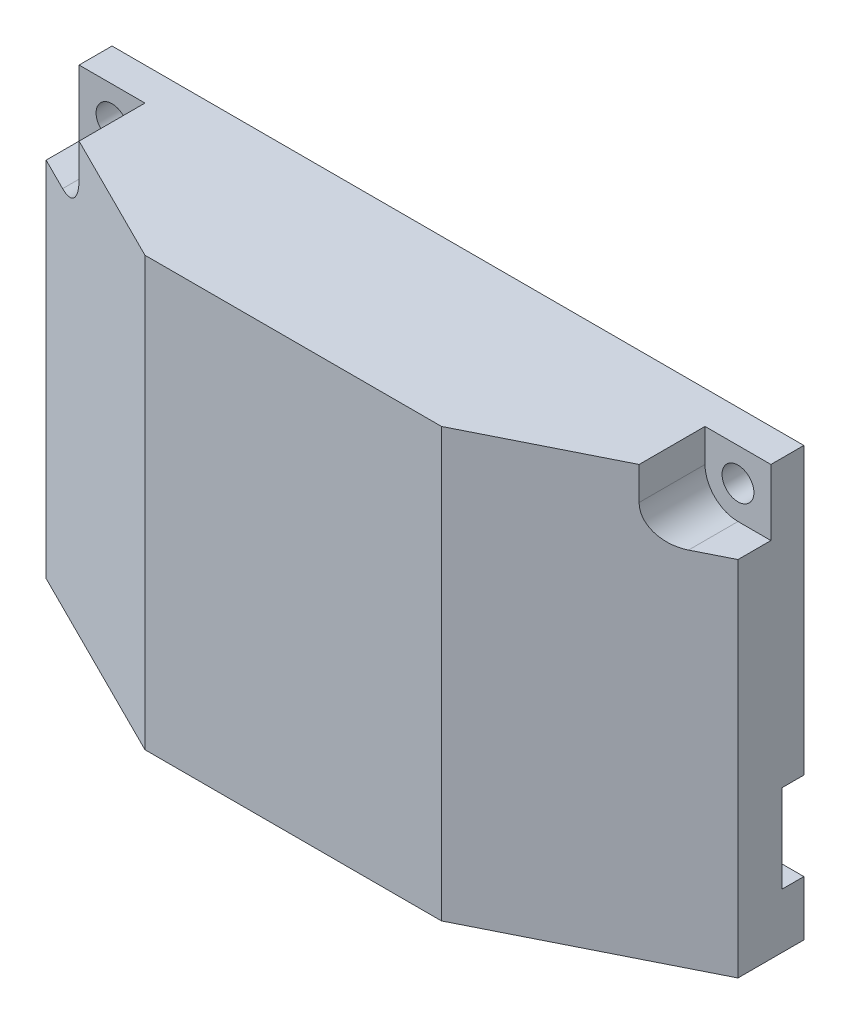
ISO-10303-21;
HEADER;
FILE_DESCRIPTION(('STEP AP214'),'2;1');
FILE_NAME('part.step','',(''),(''),'','','');
FILE_SCHEMA(('AUTOMOTIVE_DESIGN { 1 0 10303 214 1 1 1 1 }'));
ENDSEC;
DATA;
#1=APPLICATION_CONTEXT('core data for automotive mechanical design processes');
#2=APPLICATION_PROTOCOL_DEFINITION('international standard','automotive_design',2000,#1);
#3=PRODUCT_CONTEXT('',#1,'mechanical');
#4=PRODUCT('Part','Part','',(#3));
#5=PRODUCT_RELATED_PRODUCT_CATEGORY('part','',(#4));
#6=PRODUCT_DEFINITION_FORMATION('','',#4);
#7=PRODUCT_DEFINITION_CONTEXT('part definition',#1,'design');
#8=PRODUCT_DEFINITION('design','',#6,#7);
#9=PRODUCT_DEFINITION_SHAPE('','',#8);
#10=(LENGTH_UNIT() NAMED_UNIT(*) SI_UNIT(.MILLI.,.METRE.));
#11=(NAMED_UNIT(*) PLANE_ANGLE_UNIT() SI_UNIT($,.RADIAN.));
#12=(NAMED_UNIT(*) SI_UNIT($,.STERADIAN.) SOLID_ANGLE_UNIT());
#13=UNCERTAINTY_MEASURE_WITH_UNIT(LENGTH_MEASURE(1.E-05),#10,'distance_accuracy_value','');
#14=(GEOMETRIC_REPRESENTATION_CONTEXT(3) GLOBAL_UNCERTAINTY_ASSIGNED_CONTEXT((#13)) GLOBAL_UNIT_ASSIGNED_CONTEXT((#10,
#11,#12)) REPRESENTATION_CONTEXT('',''));
#15=CARTESIAN_POINT('',(0.,0.,0.));
#16=DIRECTION('',(0.,0.,1.));
#17=DIRECTION('',(1.,0.,0.));
#18=AXIS2_PLACEMENT_3D('',#15,#16,#17);
#19=CARTESIAN_POINT('',(3.,30.,33.));
#20=DIRECTION('',(0.,0.,-1.));
#21=DIRECTION('',(-1.,0.,0.));
#22=AXIS2_PLACEMENT_3D('',#19,#20,#21);
#23=CYLINDRICAL_SURFACE('',#22,1.45);
#24=CARTESIAN_POINT('',(3.,30.,0.));
#25=DIRECTION('',(0.,0.,-1.));
#26=DIRECTION('',(-1.,0.,0.));
#27=AXIS2_PLACEMENT_3D('',#24,#25,#26);
#28=CIRCLE('',#27,1.45);
#29=CARTESIAN_POINT('',(1.55,30.,0.));
#30=VERTEX_POINT('',#29);
#31=EDGE_CURVE('E363',#30,#30,#28,.T.);
#32=ORIENTED_EDGE('',*,*,#31,.T.);
#33=EDGE_LOOP('',(#32));
#34=FACE_BOUND('',#33,.T.);
#35=CARTESIAN_POINT('',(3.,30.,3.));
#36=DIRECTION('',(0.,0.,1.));
#37=DIRECTION('',(1.,0.,0.));
#38=AXIS2_PLACEMENT_3D('',#35,#36,#37);
#39=CIRCLE('',#38,1.45);
#40=CARTESIAN_POINT('',(4.45,30.,3.));
#41=VERTEX_POINT('',#40);
#42=EDGE_CURVE('E359',#41,#41,#39,.F.);
#43=ORIENTED_EDGE('',*,*,#42,.F.);
#44=EDGE_LOOP('',(#43));
#45=FACE_BOUND('',#44,.T.);
#46=ADVANCED_FACE('F36',(#34,#45),#23,.F.);
#47=CARTESIAN_POINT('',(60.,30.,33.));
#48=DIRECTION('',(0.,0.,-1.));
#49=DIRECTION('',(-1.,0.,0.));
#50=AXIS2_PLACEMENT_3D('',#47,#48,#49);
#51=CYLINDRICAL_SURFACE('',#50,1.45);
#52=CARTESIAN_POINT('',(60.,30.,0.));
#53=DIRECTION('',(0.,0.,-1.));
#54=DIRECTION('',(-1.,0.,0.));
#55=AXIS2_PLACEMENT_3D('',#52,#53,#54);
#56=CIRCLE('',#55,1.45);
#57=CARTESIAN_POINT('',(58.55,30.,0.));
#58=VERTEX_POINT('',#57);
#59=EDGE_CURVE('E412',#58,#58,#56,.T.);
#60=ORIENTED_EDGE('',*,*,#59,.T.);
#61=EDGE_LOOP('',(#60));
#62=FACE_BOUND('',#61,.T.);
#63=CARTESIAN_POINT('',(60.,30.,3.));
#64=DIRECTION('',(0.,0.,1.));
#65=DIRECTION('',(1.,0.,0.));
#66=AXIS2_PLACEMENT_3D('',#63,#64,#65);
#67=CIRCLE('',#66,1.45);
#68=CARTESIAN_POINT('',(61.45,30.,3.));
#69=VERTEX_POINT('',#68);
#70=EDGE_CURVE('E356',#69,#69,#67,.F.);
#71=ORIENTED_EDGE('',*,*,#70,.F.);
#72=EDGE_LOOP('',(#71));
#73=FACE_BOUND('',#72,.T.);
#74=ADVANCED_FACE('F565',(#62,#73),#51,.F.);
#75=CARTESIAN_POINT('',(0.,0.,0.));
#76=DIRECTION('',(0.,0.,-1.));
#77=DIRECTION('',(-1.,0.,0.));
#78=AXIS2_PLACEMENT_3D('',#75,#76,#77);
#79=PLANE('',#78);
#80=DIRECTION('',(-1.,0.,0.));
#81=VECTOR('',#80,1.);
#82=CARTESIAN_POINT('',(61.,-1.00000000000001,0.));
#83=LINE('',#82,#81);
#84=CARTESIAN_POINT('',(63.,-1.00000000000001,0.));
#85=VERTEX_POINT('',#84);
#86=CARTESIAN_POINT('',(61.,-1.00000000000001,0.));
#87=VERTEX_POINT('',#86);
#88=EDGE_CURVE('E475',#85,#87,#83,.T.);
#89=ORIENTED_EDGE('',*,*,#88,.F.);
#90=DIRECTION('',(0.,1.,0.));
#91=VECTOR('',#90,1.);
#92=CARTESIAN_POINT('',(63.,0.,0.));
#93=LINE('',#92,#91);
#94=CARTESIAN_POINT('',(63.,-6.,0.));
#95=VERTEX_POINT('',#94);
#96=EDGE_CURVE('E327',#95,#85,#93,.T.);
#97=ORIENTED_EDGE('',*,*,#96,.F.);
#98=DIRECTION('',(1.,0.,0.));
#99=VECTOR('',#98,1.);
#100=CARTESIAN_POINT('',(63.,-6.,0.));
#101=LINE('',#100,#99);
#102=CARTESIAN_POINT('',(0.,-6.00000000000001,0.));
#103=VERTEX_POINT('',#102);
#104=EDGE_CURVE('E316',#103,#95,#101,.T.);
#105=ORIENTED_EDGE('',*,*,#104,.F.);
#106=DIRECTION('',(0.,-1.,0.));
#107=VECTOR('',#106,1.);
#108=CARTESIAN_POINT('',(0.,0.,0.));
#109=LINE('',#108,#107);
#110=CARTESIAN_POINT('',(0.,33.,0.));
#111=VERTEX_POINT('',#110);
#112=EDGE_CURVE('E320',#111,#103,#109,.T.);
#113=ORIENTED_EDGE('',*,*,#112,.F.);
#114=DIRECTION('',(-1.,0.,0.));
#115=VECTOR('',#114,1.);
#116=CARTESIAN_POINT('',(0.,33.,0.));
#117=LINE('',#116,#115);
#118=CARTESIAN_POINT('',(63.,33.,0.));
#119=VERTEX_POINT('',#118);
#120=EDGE_CURVE('E330',#119,#111,#117,.T.);
#121=ORIENTED_EDGE('',*,*,#120,.F.);
#122=CARTESIAN_POINT('',(63.,6.99999999999999,0.));
#123=VERTEX_POINT('',#122);
#124=EDGE_CURVE('E326',#123,#119,#93,.T.);
#125=ORIENTED_EDGE('',*,*,#124,.F.);
#126=DIRECTION('',(1.,0.,0.));
#127=VECTOR('',#126,1.);
#128=CARTESIAN_POINT('',(61.,6.99999999999999,0.));
#129=LINE('',#128,#127);
#130=CARTESIAN_POINT('',(61.,6.99999999999999,0.));
#131=VERTEX_POINT('',#130);
#132=EDGE_CURVE('E471',#131,#123,#129,.T.);
#133=ORIENTED_EDGE('',*,*,#132,.F.);
#134=DIRECTION('',(0.,1.,0.));
#135=VECTOR('',#134,1.);
#136=CARTESIAN_POINT('',(61.,0.,0.));
#137=LINE('',#136,#135);
#138=CARTESIAN_POINT('',(61.,26.1270166537926,0.));
#139=VERTEX_POINT('',#138);
#140=EDGE_CURVE('E294',#131,#139,#137,.T.);
#141=ORIENTED_EDGE('',*,*,#140,.T.);
#142=CARTESIAN_POINT('',(60.,30.,0.));
#143=DIRECTION('',(0.,0.,-1.));
#144=DIRECTION('',(-1.,0.,0.));
#145=AXIS2_PLACEMENT_3D('',#142,#143,#144);
#146=CIRCLE('',#145,4.);
#147=CARTESIAN_POINT('',(56.1270166537926,31.,0.));
#148=VERTEX_POINT('',#147);
#149=EDGE_CURVE('E423',#139,#148,#146,.T.);
#150=ORIENTED_EDGE('',*,*,#149,.T.);
#151=DIRECTION('',(-1.,0.,0.));
#152=VECTOR('',#151,1.);
#153=CARTESIAN_POINT('',(0.,31.,0.));
#154=LINE('',#153,#152);
#155=CARTESIAN_POINT('',(6.87298334620742,31.,0.));
#156=VERTEX_POINT('',#155);
#157=EDGE_CURVE('E296',#148,#156,#154,.T.);
#158=ORIENTED_EDGE('',*,*,#157,.T.);
#159=CARTESIAN_POINT('',(3.,30.,0.));
#160=DIRECTION('',(0.,0.,-1.));
#161=DIRECTION('',(-1.,0.,0.));
#162=AXIS2_PLACEMENT_3D('',#159,#160,#161);
#163=CIRCLE('',#162,4.);
#164=CARTESIAN_POINT('',(2.,26.1270166537926,0.));
#165=VERTEX_POINT('',#164);
#166=EDGE_CURVE('E415',#156,#165,#163,.T.);
#167=ORIENTED_EDGE('',*,*,#166,.T.);
#168=DIRECTION('',(0.,-1.,0.));
#169=VECTOR('',#168,1.);
#170=CARTESIAN_POINT('',(2.,0.,0.));
#171=LINE('',#170,#169);
#172=CARTESIAN_POINT('',(2.,-4.00000000000001,0.));
#173=VERTEX_POINT('',#172);
#174=EDGE_CURVE('E267',#165,#173,#171,.T.);
#175=ORIENTED_EDGE('',*,*,#174,.T.);
#176=DIRECTION('',(1.,0.,0.));
#177=VECTOR('',#176,1.);
#178=CARTESIAN_POINT('',(0.,-4.00000000000001,0.));
#179=LINE('',#178,#177);
#180=CARTESIAN_POINT('',(61.,-4.,0.));
#181=VERTEX_POINT('',#180);
#182=EDGE_CURVE('E291',#173,#181,#179,.T.);
#183=ORIENTED_EDGE('',*,*,#182,.T.);
#184=EDGE_CURVE('E299',#181,#87,#137,.T.);
#185=ORIENTED_EDGE('',*,*,#184,.T.);
#186=EDGE_LOOP('',(#89,#97,#105,#113,#121,#125,#133,#141,#150,#158,#167,#175,#183,#185));
#187=FACE_BOUND('',#186,.T.);
#188=ORIENTED_EDGE('',*,*,#59,.F.);
#189=EDGE_LOOP('',(#188));
#190=FACE_BOUND('',#189,.T.);
#191=ORIENTED_EDGE('',*,*,#31,.F.);
#192=EDGE_LOOP('',(#191));
#193=FACE_BOUND('',#192,.T.);
#194=ADVANCED_FACE('F446',(#187,#190,#193),#79,.T.);
#195=CARTESIAN_POINT('',(63.,-6.,15.));
#196=DIRECTION('',(0.,1.,0.));
#197=DIRECTION('',(-1.,0.,0.));
#198=AXIS2_PLACEMENT_3D('',#195,#196,#197);
#199=PLANE('',#198);
#200=CARTESIAN_POINT('',(31.5,-6.00000000000001,12.));
#201=DIRECTION('',(0.,1.,0.));
#202=DIRECTION('',(0.,0.,1.));
#203=AXIS2_PLACEMENT_3D('',#200,#201,#202);
#204=CIRCLE('',#203,1.45);
#205=CARTESIAN_POINT('',(31.5,-6.00000000000001,13.45));
#206=VERTEX_POINT('',#205);
#207=EDGE_CURVE('E234',#206,#206,#204,.T.);
#208=ORIENTED_EDGE('',*,*,#207,.T.);
#209=EDGE_LOOP('',(#208));
#210=FACE_BOUND('',#209,.T.);
#211=DIRECTION('',(0.894427190999916,0.,-0.447213595499958));
#212=VECTOR('',#211,1.);
#213=CARTESIAN_POINT('',(59.4,-6.,7.8));
#214=LINE('',#213,#212);
#215=CARTESIAN_POINT('',(45.,-6.00000000000001,15.));
#216=VERTEX_POINT('',#215);
#217=CARTESIAN_POINT('',(63.,-6.,6.));
#218=VERTEX_POINT('',#217);
#219=EDGE_CURVE('E308',#216,#218,#214,.T.);
#220=ORIENTED_EDGE('',*,*,#219,.F.);
#221=DIRECTION('',(1.,0.,0.));
#222=VECTOR('',#221,1.);
#223=CARTESIAN_POINT('',(63.,-6.,15.));
#224=LINE('',#223,#222);
#225=CARTESIAN_POINT('',(18.,-6.00000000000001,15.));
#226=VERTEX_POINT('',#225);
#227=EDGE_CURVE('E317',#226,#216,#224,.T.);
#228=ORIENTED_EDGE('',*,*,#227,.F.);
#229=DIRECTION('',(0.894427190999916,0.,0.447213595499958));
#230=VECTOR('',#229,1.);
#231=CARTESIAN_POINT('',(54.,-6.,33.));
#232=LINE('',#231,#230);
#233=CARTESIAN_POINT('',(0.,-6.00000000000001,6.));
#234=VERTEX_POINT('',#233);
#235=EDGE_CURVE('E314',#234,#226,#232,.T.);
#236=ORIENTED_EDGE('',*,*,#235,.F.);
#237=DIRECTION('',(0.,0.,-1.));
#238=VECTOR('',#237,1.);
#239=CARTESIAN_POINT('',(0.,-6.00000000000001,15.));
#240=LINE('',#239,#238);
#241=EDGE_CURVE('E340',#234,#103,#240,.T.);
#242=ORIENTED_EDGE('',*,*,#241,.T.);
#243=ORIENTED_EDGE('',*,*,#104,.T.);
#244=DIRECTION('',(0.,0.,-1.));
#245=VECTOR('',#244,1.);
#246=CARTESIAN_POINT('',(63.,-6.,15.));
#247=LINE('',#246,#245);
#248=EDGE_CURVE('E338',#218,#95,#247,.T.);
#249=ORIENTED_EDGE('',*,*,#248,.F.);
#250=EDGE_LOOP('',(#220,#228,#236,#242,#243,#249));
#251=FACE_BOUND('',#250,.T.);
#252=ADVANCED_FACE('F38',(#210,#251),#199,.F.);
#253=CARTESIAN_POINT('',(63.,0.,15.));
#254=DIRECTION('',(-1.,0.,0.));
#255=DIRECTION('',(0.,0.,1.));
#256=AXIS2_PLACEMENT_3D('',#253,#254,#255);
#257=PLANE('',#256);
#258=ORIENTED_EDGE('',*,*,#96,.T.);
#259=DIRECTION('',(0.,0.,-1.));
#260=VECTOR('',#259,1.);
#261=CARTESIAN_POINT('',(63.,-1.00000000000001,2.));
#262=LINE('',#261,#260);
#263=CARTESIAN_POINT('',(63.,-1.00000000000001,2.));
#264=VERTEX_POINT('',#263);
#265=EDGE_CURVE('E485',#264,#85,#262,.T.);
#266=ORIENTED_EDGE('',*,*,#265,.F.);
#267=DIRECTION('',(0.,-1.,0.));
#268=VECTOR('',#267,1.);
#269=CARTESIAN_POINT('',(63.,-1.00000000000001,2.));
#270=LINE('',#269,#268);
#271=CARTESIAN_POINT('',(63.,6.99999999999999,2.));
#272=VERTEX_POINT('',#271);
#273=EDGE_CURVE('E543',#272,#264,#270,.T.);
#274=ORIENTED_EDGE('',*,*,#273,.F.);
#275=DIRECTION('',(0.,0.,-1.));
#276=VECTOR('',#275,1.);
#277=CARTESIAN_POINT('',(63.,6.99999999999999,2.));
#278=LINE('',#277,#276);
#279=EDGE_CURVE('E487',#272,#123,#278,.T.);
#280=ORIENTED_EDGE('',*,*,#279,.T.);
#281=ORIENTED_EDGE('',*,*,#124,.T.);
#282=DIRECTION('',(0.,0.,-1.));
#283=VECTOR('',#282,1.);
#284=CARTESIAN_POINT('',(63.,33.,15.));
#285=LINE('',#284,#283);
#286=CARTESIAN_POINT('',(63.,33.,3.));
#287=VERTEX_POINT('',#286);
#288=EDGE_CURVE('E335',#287,#119,#285,.T.);
#289=ORIENTED_EDGE('',*,*,#288,.F.);
#290=DIRECTION('',(0.,1.,0.));
#291=VECTOR('',#290,1.);
#292=CARTESIAN_POINT('',(63.,27.,3.));
#293=LINE('',#292,#291);
#294=CARTESIAN_POINT('',(63.,27.,3.));
#295=VERTEX_POINT('',#294);
#296=EDGE_CURVE('E406',#295,#287,#293,.T.);
#297=ORIENTED_EDGE('',*,*,#296,.F.);
#298=DIRECTION('',(0.,0.,1.));
#299=VECTOR('',#298,1.);
#300=CARTESIAN_POINT('',(63.,27.,3.));
#301=LINE('',#300,#299);
#302=CARTESIAN_POINT('',(63.,27.,6.));
#303=VERTEX_POINT('',#302);
#304=EDGE_CURVE('E398',#295,#303,#301,.T.);
#305=ORIENTED_EDGE('',*,*,#304,.T.);
#306=DIRECTION('',(0.,1.,0.));
#307=VECTOR('',#306,1.);
#308=CARTESIAN_POINT('',(63.,-16.,6.));
#309=LINE('',#308,#307);
#310=EDGE_CURVE('E305',#218,#303,#309,.T.);
#311=ORIENTED_EDGE('',*,*,#310,.F.);
#312=ORIENTED_EDGE('',*,*,#248,.T.);
#313=EDGE_LOOP('',(#258,#266,#274,#280,#281,#289,#297,#305,#311,#312));
#314=FACE_BOUND('',#313,.T.);
#315=ADVANCED_FACE('F403',(#314),#257,.F.);
#316=CARTESIAN_POINT('',(0.,33.,15.));
#317=DIRECTION('',(0.,-1.,0.));
#318=DIRECTION('',(0.,0.,-1.));
#319=AXIS2_PLACEMENT_3D('',#316,#317,#318);
#320=PLANE('',#319);
#321=DIRECTION('',(-1.,0.,0.));
#322=VECTOR('',#321,1.);
#323=CARTESIAN_POINT('',(6.,33.,3.));
#324=LINE('',#323,#322);
#325=CARTESIAN_POINT('',(6.,33.,3.));
#326=VERTEX_POINT('',#325);
#327=CARTESIAN_POINT('',(0.,33.,3.));
#328=VERTEX_POINT('',#327);
#329=EDGE_CURVE('E496',#326,#328,#324,.T.);
#330=ORIENTED_EDGE('',*,*,#329,.F.);
#331=DIRECTION('',(0.,0.,1.));
#332=VECTOR('',#331,1.);
#333=CARTESIAN_POINT('',(6.,33.,3.));
#334=LINE('',#333,#332);
#335=CARTESIAN_POINT('',(6.,33.,9.));
#336=VERTEX_POINT('',#335);
#337=EDGE_CURVE('E508',#326,#336,#334,.T.);
#338=ORIENTED_EDGE('',*,*,#337,.T.);
#339=DIRECTION('',(0.894427190999916,0.,0.447213595499958));
#340=VECTOR('',#339,1.);
#341=CARTESIAN_POINT('',(0.,33.,6.));
#342=LINE('',#341,#340);
#343=CARTESIAN_POINT('',(18.,33.,15.));
#344=VERTEX_POINT('',#343);
#345=EDGE_CURVE('E302',#336,#344,#342,.T.);
#346=ORIENTED_EDGE('',*,*,#345,.T.);
#347=DIRECTION('',(-1.,0.,0.));
#348=VECTOR('',#347,1.);
#349=CARTESIAN_POINT('',(0.,33.,15.));
#350=LINE('',#349,#348);
#351=CARTESIAN_POINT('',(45.,33.,15.));
#352=VERTEX_POINT('',#351);
#353=EDGE_CURVE('E319',#352,#344,#350,.T.);
#354=ORIENTED_EDGE('',*,*,#353,.F.);
#355=DIRECTION('',(0.894427190999916,0.,-0.447213595499958));
#356=VECTOR('',#355,1.);
#357=CARTESIAN_POINT('',(63.,33.,6.));
#358=LINE('',#357,#356);
#359=CARTESIAN_POINT('',(57.,33.,9.));
#360=VERTEX_POINT('',#359);
#361=EDGE_CURVE('E286',#352,#360,#358,.T.);
#362=ORIENTED_EDGE('',*,*,#361,.T.);
#363=DIRECTION('',(0.,0.,1.));
#364=VECTOR('',#363,1.);
#365=CARTESIAN_POINT('',(57.,33.,3.));
#366=LINE('',#365,#364);
#367=CARTESIAN_POINT('',(57.,33.,3.));
#368=VERTEX_POINT('',#367);
#369=EDGE_CURVE('E384',#368,#360,#366,.T.);
#370=ORIENTED_EDGE('',*,*,#369,.F.);
#371=DIRECTION('',(-1.,0.,0.));
#372=VECTOR('',#371,1.);
#373=CARTESIAN_POINT('',(63.,33.,3.));
#374=LINE('',#373,#372);
#375=EDGE_CURVE('E516',#287,#368,#374,.T.);
#376=ORIENTED_EDGE('',*,*,#375,.F.);
#377=ORIENTED_EDGE('',*,*,#288,.T.);
#378=ORIENTED_EDGE('',*,*,#120,.T.);
#379=DIRECTION('',(0.,0.,-1.));
#380=VECTOR('',#379,1.);
#381=CARTESIAN_POINT('',(0.,33.,15.));
#382=LINE('',#381,#380);
#383=EDGE_CURVE('E323',#328,#111,#382,.T.);
#384=ORIENTED_EDGE('',*,*,#383,.F.);
#385=EDGE_LOOP('',(#330,#338,#346,#354,#362,#370,#376,#377,#378,#384));
#386=FACE_BOUND('',#385,.T.);
#387=ADVANCED_FACE('F524',(#386),#320,.F.);
#388=CARTESIAN_POINT('',(0.,0.,15.));
#389=DIRECTION('',(1.,0.,0.));
#390=DIRECTION('',(0.,0.,-1.));
#391=AXIS2_PLACEMENT_3D('',#388,#389,#390);
#392=PLANE('',#391);
#393=DIRECTION('',(0.,1.,0.));
#394=VECTOR('',#393,1.);
#395=CARTESIAN_POINT('',(0.,-16.,6.));
#396=LINE('',#395,#394);
#397=CARTESIAN_POINT('',(0.,27.,6.));
#398=VERTEX_POINT('',#397);
#399=EDGE_CURVE('E304',#234,#398,#396,.T.);
#400=ORIENTED_EDGE('',*,*,#399,.T.);
#401=DIRECTION('',(0.,0.,1.));
#402=VECTOR('',#401,1.);
#403=CARTESIAN_POINT('',(0.,27.,3.));
#404=LINE('',#403,#402);
#405=CARTESIAN_POINT('',(0.,27.,3.));
#406=VERTEX_POINT('',#405);
#407=EDGE_CURVE('E506',#406,#398,#404,.T.);
#408=ORIENTED_EDGE('',*,*,#407,.F.);
#409=DIRECTION('',(0.,-1.,0.));
#410=VECTOR('',#409,1.);
#411=CARTESIAN_POINT('',(0.,33.,3.));
#412=LINE('',#411,#410);
#413=EDGE_CURVE('E498',#328,#406,#412,.T.);
#414=ORIENTED_EDGE('',*,*,#413,.F.);
#415=ORIENTED_EDGE('',*,*,#383,.T.);
#416=ORIENTED_EDGE('',*,*,#112,.T.);
#417=ORIENTED_EDGE('',*,*,#241,.F.);
#418=EDGE_LOOP('',(#400,#408,#414,#415,#416,#417));
#419=FACE_BOUND('',#418,.T.);
#420=ADVANCED_FACE('F604',(#419),#392,.F.);
#421=CARTESIAN_POINT('',(0.,0.,15.));
#422=DIRECTION('',(0.,0.,-1.));
#423=DIRECTION('',(-1.,0.,0.));
#424=AXIS2_PLACEMENT_3D('',#421,#422,#423);
#425=PLANE('',#424);
#426=ORIENTED_EDGE('',*,*,#227,.T.);
#427=DIRECTION('',(0.,-1.,0.));
#428=VECTOR('',#427,1.);
#429=CARTESIAN_POINT('',(45.,0.,15.));
#430=LINE('',#429,#428);
#431=EDGE_CURVE('E343',#352,#216,#430,.T.);
#432=ORIENTED_EDGE('',*,*,#431,.F.);
#433=ORIENTED_EDGE('',*,*,#353,.T.);
#434=DIRECTION('',(0.,1.,0.));
#435=VECTOR('',#434,1.);
#436=CARTESIAN_POINT('',(18.,0.,15.));
#437=LINE('',#436,#435);
#438=EDGE_CURVE('E346',#226,#344,#437,.T.);
#439=ORIENTED_EDGE('',*,*,#438,.F.);
#440=EDGE_LOOP('',(#426,#432,#433,#439));
#441=FACE_BOUND('',#440,.T.);
#442=ADVANCED_FACE('F529',(#441),#425,.F.);
#443=CARTESIAN_POINT('',(63.,-16.,6.));
#444=DIRECTION('',(0.447213595499958,0.,0.894427190999916));
#445=DIRECTION('',(0.894427190999916,0.,-0.447213595499958));
#446=AXIS2_PLACEMENT_3D('',#443,#444,#445);
#447=PLANE('',#446);
#448=DIRECTION('',(0.,-1.,0.));
#449=VECTOR('',#448,1.);
#450=CARTESIAN_POINT('',(57.,-16.,9.));
#451=LINE('',#450,#449);
#452=CARTESIAN_POINT('',(57.,30.,9.));
#453=VERTEX_POINT('',#452);
#454=EDGE_CURVE('E239',#360,#453,#451,.T.);
#455=ORIENTED_EDGE('',*,*,#454,.F.);
#456=ORIENTED_EDGE('',*,*,#361,.F.);
#457=ORIENTED_EDGE('',*,*,#431,.T.);
#458=ORIENTED_EDGE('',*,*,#219,.T.);
#459=ORIENTED_EDGE('',*,*,#310,.T.);
#460=DIRECTION('',(0.894427190999916,0.,-0.447213595499958));
#461=VECTOR('',#460,1.);
#462=CARTESIAN_POINT('',(63.,27.,6.));
#463=LINE('',#462,#461);
#464=CARTESIAN_POINT('',(60.,27.,7.5));
#465=VERTEX_POINT('',#464);
#466=EDGE_CURVE('E370',#465,#303,#463,.T.);
#467=ORIENTED_EDGE('',*,*,#466,.F.);
#468=CARTESIAN_POINT('',(60.,30.,7.5));
#469=DIRECTION('',(0.447213595499958,0.,0.894427190999916));
#470=DIRECTION('',(-0.894427190999916,0.,0.447213595499958));
#471=AXIS2_PLACEMENT_3D('',#468,#469,#470);
#472=ELLIPSE('',#471,3.35410196624969,3.);
#473=EDGE_CURVE('E371',#453,#465,#472,.T.);
#474=ORIENTED_EDGE('',*,*,#473,.F.);
#475=EDGE_LOOP('',(#455,#456,#457,#458,#459,#467,#474));
#476=FACE_BOUND('',#475,.T.);
#477=ADVANCED_FACE('F392',(#476),#447,.T.);
#478=CARTESIAN_POINT('',(0.,-16.,6.));
#479=DIRECTION('',(-0.447213595499958,0.,0.894427190999916));
#480=DIRECTION('',(0.894427190999916,0.,0.447213595499958));
#481=AXIS2_PLACEMENT_3D('',#478,#479,#480);
#482=PLANE('',#481);
#483=DIRECTION('',(0.894427190999916,0.,0.447213595499958));
#484=VECTOR('',#483,1.);
#485=CARTESIAN_POINT('',(0.,27.,6.));
#486=LINE('',#485,#484);
#487=CARTESIAN_POINT('',(3.,27.,7.5));
#488=VERTEX_POINT('',#487);
#489=EDGE_CURVE('E368',#398,#488,#486,.T.);
#490=ORIENTED_EDGE('',*,*,#489,.F.);
#491=ORIENTED_EDGE('',*,*,#399,.F.);
#492=ORIENTED_EDGE('',*,*,#235,.T.);
#493=ORIENTED_EDGE('',*,*,#438,.T.);
#494=ORIENTED_EDGE('',*,*,#345,.F.);
#495=DIRECTION('',(0.,1.,0.));
#496=VECTOR('',#495,1.);
#497=CARTESIAN_POINT('',(6.,-16.,9.));
#498=LINE('',#497,#496);
#499=CARTESIAN_POINT('',(6.,30.,9.));
#500=VERTEX_POINT('',#499);
#501=EDGE_CURVE('E355',#500,#336,#498,.T.);
#502=ORIENTED_EDGE('',*,*,#501,.F.);
#503=CARTESIAN_POINT('',(3.,30.,7.5));
#504=DIRECTION('',(-0.447213595499958,0.,0.894427190999916));
#505=DIRECTION('',(0.894427190999916,0.,0.447213595499958));
#506=AXIS2_PLACEMENT_3D('',#503,#504,#505);
#507=ELLIPSE('',#506,3.35410196624968,3.);
#508=EDGE_CURVE('E365',#488,#500,#507,.T.);
#509=ORIENTED_EDGE('',*,*,#508,.F.);
#510=EDGE_LOOP('',(#490,#491,#492,#493,#494,#502,#509));
#511=FACE_BOUND('',#510,.T.);
#512=ADVANCED_FACE('F584',(#511),#482,.T.);
#513=CARTESIAN_POINT('',(63.,-4.,15.));
#514=DIRECTION('',(0.,1.,0.));
#515=DIRECTION('',(-1.,0.,0.));
#516=AXIS2_PLACEMENT_3D('',#513,#514,#515);
#517=PLANE('',#516);
#518=CARTESIAN_POINT('',(31.5,-4.,12.));
#519=DIRECTION('',(0.,1.,0.));
#520=DIRECTION('',(-1.,0.,0.));
#521=AXIS2_PLACEMENT_3D('',#518,#519,#520);
#522=CIRCLE('',#521,2.99999999999999);
#523=CARTESIAN_POINT('',(34.3284271247462,-4.,13.));
#524=VERTEX_POINT('',#523);
#525=CARTESIAN_POINT('',(28.6715728752538,-4.00000000000001,13.));
#526=VERTEX_POINT('',#525);
#527=EDGE_CURVE('E249',#524,#526,#522,.T.);
#528=ORIENTED_EDGE('',*,*,#527,.F.);
#529=DIRECTION('',(1.,0.,0.));
#530=VECTOR('',#529,1.);
#531=CARTESIAN_POINT('',(0.,-4.00000000000001,13.));
#532=LINE('',#531,#530);
#533=CARTESIAN_POINT('',(44.5278640450004,-4.,13.));
#534=VERTEX_POINT('',#533);
#535=EDGE_CURVE('E262',#524,#534,#532,.T.);
#536=ORIENTED_EDGE('',*,*,#535,.T.);
#537=DIRECTION('',(0.894427190999916,0.,-0.447213595499958));
#538=VECTOR('',#537,1.);
#539=CARTESIAN_POINT('',(58.5055728090001,-4.,6.01114561800017));
#540=LINE('',#539,#538);
#541=CARTESIAN_POINT('',(61.,-4.,4.76393202250021));
#542=VERTEX_POINT('',#541);
#543=EDGE_CURVE('E270',#534,#542,#540,.T.);
#544=ORIENTED_EDGE('',*,*,#543,.T.);
#545=DIRECTION('',(0.,0.,-1.));
#546=VECTOR('',#545,1.);
#547=CARTESIAN_POINT('',(61.,-4.,15.));
#548=LINE('',#547,#546);
#549=EDGE_CURVE('E265',#542,#181,#548,.T.);
#550=ORIENTED_EDGE('',*,*,#549,.T.);
#551=ORIENTED_EDGE('',*,*,#182,.F.);
#552=DIRECTION('',(0.,0.,-1.));
#553=VECTOR('',#552,1.);
#554=CARTESIAN_POINT('',(2.,-4.00000000000001,15.));
#555=LINE('',#554,#553);
#556=CARTESIAN_POINT('',(2.,-4.00000000000001,4.76393202250021));
#557=VERTEX_POINT('',#556);
#558=EDGE_CURVE('E290',#557,#173,#555,.T.);
#559=ORIENTED_EDGE('',*,*,#558,.F.);
#560=DIRECTION('',(0.894427190999916,0.,0.447213595499958));
#561=VECTOR('',#560,1.);
#562=CARTESIAN_POINT('',(54.8944271909999,-4.,31.2111456180002));
#563=LINE('',#562,#561);
#564=CARTESIAN_POINT('',(18.4721359549996,-4.00000000000001,13.));
#565=VERTEX_POINT('',#564);
#566=EDGE_CURVE('E259',#557,#565,#563,.T.);
#567=ORIENTED_EDGE('',*,*,#566,.T.);
#568=EDGE_CURVE('E253',#565,#526,#532,.T.);
#569=ORIENTED_EDGE('',*,*,#568,.T.);
#570=EDGE_LOOP('',(#528,#536,#544,#550,#551,#559,#567,#569));
#571=FACE_BOUND('',#570,.T.);
#572=ADVANCED_FACE('F255',(#571),#517,.T.);
#573=CARTESIAN_POINT('',(61.,0.,15.));
#574=DIRECTION('',(-1.,0.,0.));
#575=DIRECTION('',(0.,0.,1.));
#576=AXIS2_PLACEMENT_3D('',#573,#574,#575);
#577=PLANE('',#576);
#578=DIRECTION('',(0.,0.,-1.));
#579=VECTOR('',#578,1.);
#580=CARTESIAN_POINT('',(61.,-1.00000000000001,2.));
#581=LINE('',#580,#579);
#582=CARTESIAN_POINT('',(61.,-1.00000000000001,2.));
#583=VERTEX_POINT('',#582);
#584=EDGE_CURVE('E443',#583,#87,#581,.T.);
#585=ORIENTED_EDGE('',*,*,#584,.T.);
#586=ORIENTED_EDGE('',*,*,#184,.F.);
#587=ORIENTED_EDGE('',*,*,#549,.F.);
#588=DIRECTION('',(0.,1.,0.));
#589=VECTOR('',#588,1.);
#590=CARTESIAN_POINT('',(61.,0.,4.76393202250021));
#591=LINE('',#590,#589);
#592=CARTESIAN_POINT('',(61.,26.1270166537926,4.76393202250021));
#593=VERTEX_POINT('',#592);
#594=EDGE_CURVE('E272',#542,#593,#591,.T.);
#595=ORIENTED_EDGE('',*,*,#594,.T.);
#596=DIRECTION('',(0.,0.,-1.));
#597=VECTOR('',#596,1.);
#598=CARTESIAN_POINT('',(61.,26.1270166537926,10.));
#599=LINE('',#598,#597);
#600=EDGE_CURVE('E281',#139,#593,#599,.F.);
#601=ORIENTED_EDGE('',*,*,#600,.F.);
#602=ORIENTED_EDGE('',*,*,#140,.F.);
#603=DIRECTION('',(0.,0.,-1.));
#604=VECTOR('',#603,1.);
#605=CARTESIAN_POINT('',(61.,6.99999999999999,2.));
#606=LINE('',#605,#604);
#607=CARTESIAN_POINT('',(61.,6.99999999999999,2.));
#608=VERTEX_POINT('',#607);
#609=EDGE_CURVE('E489',#608,#131,#606,.T.);
#610=ORIENTED_EDGE('',*,*,#609,.F.);
#611=DIRECTION('',(0.,1.,0.));
#612=VECTOR('',#611,1.);
#613=CARTESIAN_POINT('',(61.,-1.00000000000001,2.));
#614=LINE('',#613,#612);
#615=EDGE_CURVE('E477',#583,#608,#614,.T.);
#616=ORIENTED_EDGE('',*,*,#615,.F.);
#617=EDGE_LOOP('',(#585,#586,#587,#595,#601,#602,#610,#616));
#618=FACE_BOUND('',#617,.T.);
#619=ADVANCED_FACE('F440',(#618),#577,.T.);
#620=CARTESIAN_POINT('',(0.,31.,15.));
#621=DIRECTION('',(0.,-1.,0.));
#622=DIRECTION('',(0.,0.,-1.));
#623=AXIS2_PLACEMENT_3D('',#620,#621,#622);
#624=PLANE('',#623);
#625=DIRECTION('',(0.,0.,-1.));
#626=VECTOR('',#625,1.);
#627=CARTESIAN_POINT('',(6.87298334620742,31.,10.));
#628=LINE('',#627,#626);
#629=CARTESIAN_POINT('',(6.87298334620742,31.,7.20042369560392));
#630=VERTEX_POINT('',#629);
#631=EDGE_CURVE('E420',#630,#156,#628,.T.);
#632=ORIENTED_EDGE('',*,*,#631,.T.);
#633=ORIENTED_EDGE('',*,*,#157,.F.);
#634=DIRECTION('',(0.,0.,-1.));
#635=VECTOR('',#634,1.);
#636=CARTESIAN_POINT('',(56.1270166537926,31.,10.));
#637=LINE('',#636,#635);
#638=CARTESIAN_POINT('',(56.1270166537926,31.,7.20042369560392));
#639=VERTEX_POINT('',#638);
#640=EDGE_CURVE('E427',#639,#148,#637,.T.);
#641=ORIENTED_EDGE('',*,*,#640,.F.);
#642=DIRECTION('',(0.894427190999916,0.,-0.447213595499958));
#643=VECTOR('',#642,1.);
#644=CARTESIAN_POINT('',(62.1055728090001,31.,4.21114561800016));
#645=LINE('',#644,#643);
#646=CARTESIAN_POINT('',(44.5278640450004,31.,13.));
#647=VERTEX_POINT('',#646);
#648=EDGE_CURVE('E276',#647,#639,#645,.T.);
#649=ORIENTED_EDGE('',*,*,#648,.F.);
#650=DIRECTION('',(-1.,0.,0.));
#651=VECTOR('',#650,1.);
#652=CARTESIAN_POINT('',(0.,31.,13.));
#653=LINE('',#652,#651);
#654=CARTESIAN_POINT('',(18.4721359549996,31.,13.));
#655=VERTEX_POINT('',#654);
#656=EDGE_CURVE('E261',#647,#655,#653,.T.);
#657=ORIENTED_EDGE('',*,*,#656,.T.);
#658=DIRECTION('',(0.894427190999916,0.,0.447213595499958));
#659=VECTOR('',#658,1.);
#660=CARTESIAN_POINT('',(0.894427190999917,31.,4.21114561800017));
#661=LINE('',#660,#659);
#662=EDGE_CURVE('E275',#630,#655,#661,.T.);
#663=ORIENTED_EDGE('',*,*,#662,.F.);
#664=EDGE_LOOP('',(#632,#633,#641,#649,#657,#663));
#665=FACE_BOUND('',#664,.T.);
#666=ADVANCED_FACE('F457',(#665),#624,.T.);
#667=CARTESIAN_POINT('',(2.,0.,15.));
#668=DIRECTION('',(1.,0.,0.));
#669=DIRECTION('',(0.,0.,-1.));
#670=AXIS2_PLACEMENT_3D('',#667,#668,#669);
#671=PLANE('',#670);
#672=DIRECTION('',(0.,0.,-1.));
#673=VECTOR('',#672,1.);
#674=CARTESIAN_POINT('',(2.,26.1270166537926,10.));
#675=LINE('',#674,#673);
#676=CARTESIAN_POINT('',(2.,26.1270166537926,4.76393202250021));
#677=VERTEX_POINT('',#676);
#678=EDGE_CURVE('E421',#677,#165,#675,.T.);
#679=ORIENTED_EDGE('',*,*,#678,.F.);
#680=DIRECTION('',(0.,1.,0.));
#681=VECTOR('',#680,1.);
#682=CARTESIAN_POINT('',(2.,-16.,4.76393202250021));
#683=LINE('',#682,#681);
#684=EDGE_CURVE('E277',#557,#677,#683,.T.);
#685=ORIENTED_EDGE('',*,*,#684,.F.);
#686=ORIENTED_EDGE('',*,*,#558,.T.);
#687=ORIENTED_EDGE('',*,*,#174,.F.);
#688=EDGE_LOOP('',(#679,#685,#686,#687));
#689=FACE_BOUND('',#688,.T.);
#690=ADVANCED_FACE('F451',(#689),#671,.T.);
#691=CARTESIAN_POINT('',(0.,0.,13.));
#692=DIRECTION('',(0.,0.,-1.));
#693=DIRECTION('',(-1.,0.,0.));
#694=AXIS2_PLACEMENT_3D('',#691,#692,#693);
#695=PLANE('',#694);
#696=DIRECTION('',(0.,-1.,0.));
#697=VECTOR('',#696,1.);
#698=CARTESIAN_POINT('',(34.3284271247462,2.,13.));
#699=LINE('',#698,#697);
#700=CARTESIAN_POINT('',(34.3284271247462,2.,13.));
#701=VERTEX_POINT('',#700);
#702=EDGE_CURVE('E11',#701,#524,#699,.T.);
#703=ORIENTED_EDGE('',*,*,#702,.F.);
#704=DIRECTION('',(-1.,0.,0.));
#705=VECTOR('',#704,1.);
#706=CARTESIAN_POINT('',(0.,1.99999999999999,13.));
#707=LINE('',#706,#705);
#708=CARTESIAN_POINT('',(32.55,2.,13.));
#709=VERTEX_POINT('',#708);
#710=EDGE_CURVE('E241',#701,#709,#707,.T.);
#711=ORIENTED_EDGE('',*,*,#710,.T.);
#712=CARTESIAN_POINT('',(30.45,1.99999999999999,13.));
#713=VERTEX_POINT('',#712);
#714=EDGE_CURVE('E227',#709,#713,#707,.T.);
#715=ORIENTED_EDGE('',*,*,#714,.T.);
#716=CARTESIAN_POINT('',(28.6715728752538,2.,13.));
#717=VERTEX_POINT('',#716);
#718=EDGE_CURVE('E58',#713,#717,#707,.T.);
#719=ORIENTED_EDGE('',*,*,#718,.T.);
#720=DIRECTION('',(0.,-1.,0.));
#721=VECTOR('',#720,1.);
#722=CARTESIAN_POINT('',(28.6715728752538,2.,13.));
#723=LINE('',#722,#721);
#724=EDGE_CURVE('E44',#526,#717,#723,.F.);
#725=ORIENTED_EDGE('',*,*,#724,.F.);
#726=ORIENTED_EDGE('',*,*,#568,.F.);
#727=DIRECTION('',(0.,1.,0.));
#728=VECTOR('',#727,1.);
#729=CARTESIAN_POINT('',(18.4721359549996,0.,13.));
#730=LINE('',#729,#728);
#731=EDGE_CURVE('E284',#565,#655,#730,.T.);
#732=ORIENTED_EDGE('',*,*,#731,.T.);
#733=ORIENTED_EDGE('',*,*,#656,.F.);
#734=DIRECTION('',(0.,-1.,0.));
#735=VECTOR('',#734,1.);
#736=CARTESIAN_POINT('',(44.5278640450004,0.,13.));
#737=LINE('',#736,#735);
#738=EDGE_CURVE('E287',#647,#534,#737,.T.);
#739=ORIENTED_EDGE('',*,*,#738,.T.);
#740=ORIENTED_EDGE('',*,*,#535,.F.);
#741=EDGE_LOOP('',(#703,#711,#715,#719,#725,#726,#732,#733,#739,#740));
#742=FACE_BOUND('',#741,.T.);
#743=ADVANCED_FACE('F243',(#742),#695,.T.);
#744=CARTESIAN_POINT('',(62.1055728090001,-16.,4.21114561800017));
#745=DIRECTION('',(0.447213595499958,0.,0.894427190999916));
#746=DIRECTION('',(0.894427190999916,0.,-0.447213595499958));
#747=AXIS2_PLACEMENT_3D('',#744,#745,#746);
#748=PLANE('',#747);
#749=ORIENTED_EDGE('',*,*,#648,.T.);
#750=CARTESIAN_POINT('',(60.,30.,5.26393202250021));
#751=DIRECTION('',(0.447213595499958,0.,0.894427190999916));
#752=DIRECTION('',(0.894427190999916,0.,-0.447213595499958));
#753=AXIS2_PLACEMENT_3D('',#750,#751,#752);
#754=ELLIPSE('',#753,4.47213595499958,4.);
#755=EDGE_CURVE('E349',#639,#593,#754,.T.);
#756=ORIENTED_EDGE('',*,*,#755,.T.);
#757=ORIENTED_EDGE('',*,*,#594,.F.);
#758=ORIENTED_EDGE('',*,*,#543,.F.);
#759=ORIENTED_EDGE('',*,*,#738,.F.);
#760=EDGE_LOOP('',(#749,#756,#757,#758,#759));
#761=FACE_BOUND('',#760,.T.);
#762=ADVANCED_FACE('F462',(#761),#748,.F.);
#763=CARTESIAN_POINT('',(0.894427190999918,-16.,4.21114561800017));
#764=DIRECTION('',(-0.447213595499958,0.,0.894427190999916));
#765=DIRECTION('',(0.894427190999916,0.,0.447213595499958));
#766=AXIS2_PLACEMENT_3D('',#763,#764,#765);
#767=PLANE('',#766);
#768=ORIENTED_EDGE('',*,*,#684,.T.);
#769=CARTESIAN_POINT('',(3.,30.,5.26393202250021));
#770=DIRECTION('',(-0.447213595499958,0.,0.894427190999916));
#771=DIRECTION('',(-0.894427190999916,0.,-0.447213595499958));
#772=AXIS2_PLACEMENT_3D('',#769,#770,#771);
#773=ELLIPSE('',#772,4.47213595499958,4.);
#774=EDGE_CURVE('E352',#677,#630,#773,.T.);
#775=ORIENTED_EDGE('',*,*,#774,.T.);
#776=ORIENTED_EDGE('',*,*,#662,.T.);
#777=ORIENTED_EDGE('',*,*,#731,.F.);
#778=ORIENTED_EDGE('',*,*,#566,.F.);
#779=EDGE_LOOP('',(#768,#775,#776,#777,#778));
#780=FACE_BOUND('',#779,.T.);
#781=ADVANCED_FACE('F453',(#780),#767,.F.);
#782=CARTESIAN_POINT('',(60.,30.,10.));
#783=DIRECTION('',(0.,0.,-1.));
#784=DIRECTION('',(-1.,0.,0.));
#785=AXIS2_PLACEMENT_3D('',#782,#783,#784);
#786=CYLINDRICAL_SURFACE('',#785,4.);
#787=ORIENTED_EDGE('',*,*,#149,.F.);
#788=ORIENTED_EDGE('',*,*,#600,.T.);
#789=ORIENTED_EDGE('',*,*,#755,.F.);
#790=ORIENTED_EDGE('',*,*,#640,.T.);
#791=EDGE_LOOP('',(#787,#788,#789,#790));
#792=FACE_BOUND('',#791,.T.);
#793=ADVANCED_FACE('F468',(#792),#786,.T.);
#794=CARTESIAN_POINT('',(3.,30.,10.));
#795=DIRECTION('',(0.,0.,-1.));
#796=DIRECTION('',(-1.,0.,0.));
#797=AXIS2_PLACEMENT_3D('',#794,#795,#796);
#798=CYLINDRICAL_SURFACE('',#797,4.);
#799=ORIENTED_EDGE('',*,*,#774,.F.);
#800=ORIENTED_EDGE('',*,*,#678,.T.);
#801=ORIENTED_EDGE('',*,*,#166,.F.);
#802=ORIENTED_EDGE('',*,*,#631,.F.);
#803=EDGE_LOOP('',(#799,#800,#801,#802));
#804=FACE_BOUND('',#803,.T.);
#805=ADVANCED_FACE('F576',(#804),#798,.T.);
#806=CARTESIAN_POINT('',(60.,30.,3.));
#807=DIRECTION('',(0.,0.,1.));
#808=DIRECTION('',(1.,0.,0.));
#809=AXIS2_PLACEMENT_3D('',#806,#807,#808);
#810=PLANE('',#809);
#811=CARTESIAN_POINT('',(60.,30.,3.));
#812=DIRECTION('',(0.,0.,1.));
#813=DIRECTION('',(1.,0.,0.));
#814=AXIS2_PLACEMENT_3D('',#811,#812,#813);
#815=CIRCLE('',#814,3.);
#816=CARTESIAN_POINT('',(57.,30.,3.));
#817=VERTEX_POINT('',#816);
#818=CARTESIAN_POINT('',(60.,27.,3.));
#819=VERTEX_POINT('',#818);
#820=EDGE_CURVE('E388',#817,#819,#815,.T.);
#821=ORIENTED_EDGE('',*,*,#820,.T.);
#822=DIRECTION('',(1.,0.,0.));
#823=VECTOR('',#822,1.);
#824=CARTESIAN_POINT('',(60.,27.,3.));
#825=LINE('',#824,#823);
#826=EDGE_CURVE('E513',#819,#295,#825,.T.);
#827=ORIENTED_EDGE('',*,*,#826,.T.);
#828=ORIENTED_EDGE('',*,*,#296,.T.);
#829=ORIENTED_EDGE('',*,*,#375,.T.);
#830=DIRECTION('',(0.,-1.,0.));
#831=VECTOR('',#830,1.);
#832=CARTESIAN_POINT('',(57.,33.,3.));
#833=LINE('',#832,#831);
#834=EDGE_CURVE('E409',#368,#817,#833,.T.);
#835=ORIENTED_EDGE('',*,*,#834,.T.);
#836=EDGE_LOOP('',(#821,#827,#828,#829,#835));
#837=FACE_BOUND('',#836,.T.);
#838=ORIENTED_EDGE('',*,*,#70,.T.);
#839=EDGE_LOOP('',(#838));
#840=FACE_BOUND('',#839,.T.);
#841=ADVANCED_FACE('F519',(#837,#840),#810,.T.);
#842=CARTESIAN_POINT('',(60.,30.,3.));
#843=DIRECTION('',(0.,0.,1.));
#844=DIRECTION('',(1.,0.,0.));
#845=AXIS2_PLACEMENT_3D('',#842,#843,#844);
#846=CYLINDRICAL_SURFACE('',#845,3.);
#847=ORIENTED_EDGE('',*,*,#473,.T.);
#848=DIRECTION('',(0.,0.,1.));
#849=VECTOR('',#848,1.);
#850=CARTESIAN_POINT('',(60.,27.,3.));
#851=LINE('',#850,#849);
#852=EDGE_CURVE('E400',#819,#465,#851,.T.);
#853=ORIENTED_EDGE('',*,*,#852,.F.);
#854=ORIENTED_EDGE('',*,*,#820,.F.);
#855=DIRECTION('',(0.,0.,1.));
#856=VECTOR('',#855,1.);
#857=CARTESIAN_POINT('',(57.,30.,3.));
#858=LINE('',#857,#856);
#859=EDGE_CURVE('E381',#817,#453,#858,.T.);
#860=ORIENTED_EDGE('',*,*,#859,.T.);
#861=EDGE_LOOP('',(#847,#853,#854,#860));
#862=FACE_BOUND('',#861,.T.);
#863=ADVANCED_FACE('F386',(#862),#846,.F.);
#864=CARTESIAN_POINT('',(57.,33.,3.));
#865=DIRECTION('',(-1.,0.,0.));
#866=DIRECTION('',(0.,0.,1.));
#867=AXIS2_PLACEMENT_3D('',#864,#865,#866);
#868=PLANE('',#867);
#869=ORIENTED_EDGE('',*,*,#454,.T.);
#870=ORIENTED_EDGE('',*,*,#859,.F.);
#871=ORIENTED_EDGE('',*,*,#834,.F.);
#872=ORIENTED_EDGE('',*,*,#369,.T.);
#873=EDGE_LOOP('',(#869,#870,#871,#872));
#874=FACE_BOUND('',#873,.T.);
#875=ADVANCED_FACE('F379',(#874),#868,.F.);
#876=CARTESIAN_POINT('',(60.,27.,3.));
#877=DIRECTION('',(0.,-1.,0.));
#878=DIRECTION('',(0.,0.,-1.));
#879=AXIS2_PLACEMENT_3D('',#876,#877,#878);
#880=PLANE('',#879);
#881=ORIENTED_EDGE('',*,*,#466,.T.);
#882=ORIENTED_EDGE('',*,*,#304,.F.);
#883=ORIENTED_EDGE('',*,*,#826,.F.);
#884=ORIENTED_EDGE('',*,*,#852,.T.);
#885=EDGE_LOOP('',(#881,#882,#883,#884));
#886=FACE_BOUND('',#885,.T.);
#887=ADVANCED_FACE('F396',(#886),#880,.F.);
#888=CARTESIAN_POINT('',(3.,30.,3.));
#889=DIRECTION('',(0.,0.,1.));
#890=DIRECTION('',(1.,0.,0.));
#891=AXIS2_PLACEMENT_3D('',#888,#889,#890);
#892=PLANE('',#891);
#893=CARTESIAN_POINT('',(3.,30.,3.));
#894=DIRECTION('',(0.,0.,1.));
#895=DIRECTION('',(1.,0.,0.));
#896=AXIS2_PLACEMENT_3D('',#893,#894,#895);
#897=CIRCLE('',#896,3.);
#898=CARTESIAN_POINT('',(3.,27.,3.));
#899=VERTEX_POINT('',#898);
#900=CARTESIAN_POINT('',(6.,30.,3.));
#901=VERTEX_POINT('',#900);
#902=EDGE_CURVE('E390',#899,#901,#897,.T.);
#903=ORIENTED_EDGE('',*,*,#902,.T.);
#904=DIRECTION('',(0.,1.,0.));
#905=VECTOR('',#904,1.);
#906=CARTESIAN_POINT('',(6.,30.,3.));
#907=LINE('',#906,#905);
#908=EDGE_CURVE('E493',#901,#326,#907,.T.);
#909=ORIENTED_EDGE('',*,*,#908,.T.);
#910=ORIENTED_EDGE('',*,*,#329,.T.);
#911=ORIENTED_EDGE('',*,*,#413,.T.);
#912=DIRECTION('',(1.,0.,0.));
#913=VECTOR('',#912,1.);
#914=CARTESIAN_POINT('',(0.,27.,3.));
#915=LINE('',#914,#913);
#916=EDGE_CURVE('E500',#406,#899,#915,.T.);
#917=ORIENTED_EDGE('',*,*,#916,.T.);
#918=EDGE_LOOP('',(#903,#909,#910,#911,#917));
#919=FACE_BOUND('',#918,.T.);
#920=ORIENTED_EDGE('',*,*,#42,.T.);
#921=EDGE_LOOP('',(#920));
#922=FACE_BOUND('',#921,.T.);
#923=ADVANCED_FACE('F692',(#919,#922),#892,.T.);
#924=CARTESIAN_POINT('',(3.,30.,3.));
#925=DIRECTION('',(0.,0.,1.));
#926=DIRECTION('',(1.,0.,0.));
#927=AXIS2_PLACEMENT_3D('',#924,#925,#926);
#928=CYLINDRICAL_SURFACE('',#927,3.);
#929=ORIENTED_EDGE('',*,*,#508,.T.);
#930=DIRECTION('',(0.,0.,1.));
#931=VECTOR('',#930,1.);
#932=CARTESIAN_POINT('',(6.,30.,3.));
#933=LINE('',#932,#931);
#934=EDGE_CURVE('E503',#901,#500,#933,.T.);
#935=ORIENTED_EDGE('',*,*,#934,.F.);
#936=ORIENTED_EDGE('',*,*,#902,.F.);
#937=DIRECTION('',(0.,0.,1.));
#938=VECTOR('',#937,1.);
#939=CARTESIAN_POINT('',(3.,27.,3.));
#940=LINE('',#939,#938);
#941=EDGE_CURVE('E360',#899,#488,#940,.T.);
#942=ORIENTED_EDGE('',*,*,#941,.T.);
#943=EDGE_LOOP('',(#929,#935,#936,#942));
#944=FACE_BOUND('',#943,.T.);
#945=ADVANCED_FACE('F701',(#944),#928,.F.);
#946=CARTESIAN_POINT('',(0.,27.,3.));
#947=DIRECTION('',(0.,-1.,0.));
#948=DIRECTION('',(0.,0.,-1.));
#949=AXIS2_PLACEMENT_3D('',#946,#947,#948);
#950=PLANE('',#949);
#951=ORIENTED_EDGE('',*,*,#489,.T.);
#952=ORIENTED_EDGE('',*,*,#941,.F.);
#953=ORIENTED_EDGE('',*,*,#916,.F.);
#954=ORIENTED_EDGE('',*,*,#407,.T.);
#955=EDGE_LOOP('',(#951,#952,#953,#954));
#956=FACE_BOUND('',#955,.T.);
#957=ADVANCED_FACE('F711',(#956),#950,.F.);
#958=CARTESIAN_POINT('',(6.,30.,3.));
#959=DIRECTION('',(1.,0.,0.));
#960=DIRECTION('',(0.,0.,-1.));
#961=AXIS2_PLACEMENT_3D('',#958,#959,#960);
#962=PLANE('',#961);
#963=ORIENTED_EDGE('',*,*,#501,.T.);
#964=ORIENTED_EDGE('',*,*,#337,.F.);
#965=ORIENTED_EDGE('',*,*,#908,.F.);
#966=ORIENTED_EDGE('',*,*,#934,.T.);
#967=EDGE_LOOP('',(#963,#964,#965,#966));
#968=FACE_BOUND('',#967,.T.);
#969=ADVANCED_FACE('F720',(#968),#962,.F.);
#970=CARTESIAN_POINT('',(61.,-1.00000000000001,2.));
#971=DIRECTION('',(0.,-1.,0.));
#972=DIRECTION('',(0.,0.,-1.));
#973=AXIS2_PLACEMENT_3D('',#970,#971,#972);
#974=PLANE('',#973);
#975=ORIENTED_EDGE('',*,*,#88,.T.);
#976=ORIENTED_EDGE('',*,*,#584,.F.);
#977=DIRECTION('',(-1.,0.,0.));
#978=VECTOR('',#977,1.);
#979=CARTESIAN_POINT('',(61.,-1.00000000000001,2.));
#980=LINE('',#979,#978);
#981=EDGE_CURVE('E481',#264,#583,#980,.T.);
#982=ORIENTED_EDGE('',*,*,#981,.F.);
#983=ORIENTED_EDGE('',*,*,#265,.T.);
#984=EDGE_LOOP('',(#975,#976,#982,#983));
#985=FACE_BOUND('',#984,.T.);
#986=ADVANCED_FACE('F540',(#985),#974,.F.);
#987=CARTESIAN_POINT('',(61.,6.99999999999999,2.));
#988=DIRECTION('',(0.,1.,0.));
#989=DIRECTION('',(0.,0.,1.));
#990=AXIS2_PLACEMENT_3D('',#987,#988,#989);
#991=PLANE('',#990);
#992=ORIENTED_EDGE('',*,*,#132,.T.);
#993=ORIENTED_EDGE('',*,*,#279,.F.);
#994=DIRECTION('',(1.,0.,0.));
#995=VECTOR('',#994,1.);
#996=CARTESIAN_POINT('',(61.,6.99999999999999,2.));
#997=LINE('',#996,#995);
#998=EDGE_CURVE('E546',#608,#272,#997,.T.);
#999=ORIENTED_EDGE('',*,*,#998,.F.);
#1000=ORIENTED_EDGE('',*,*,#609,.T.);
#1001=EDGE_LOOP('',(#992,#993,#999,#1000));
#1002=FACE_BOUND('',#1001,.T.);
#1003=ADVANCED_FACE('F739',(#1002),#991,.F.);
#1004=CARTESIAN_POINT('',(0.,0.,2.));
#1005=DIRECTION('',(0.,0.,-1.));
#1006=DIRECTION('',(-1.,0.,0.));
#1007=AXIS2_PLACEMENT_3D('',#1004,#1005,#1006);
#1008=PLANE('',#1007);
#1009=ORIENTED_EDGE('',*,*,#615,.T.);
#1010=ORIENTED_EDGE('',*,*,#998,.T.);
#1011=ORIENTED_EDGE('',*,*,#273,.T.);
#1012=ORIENTED_EDGE('',*,*,#981,.T.);
#1013=EDGE_LOOP('',(#1009,#1010,#1011,#1012));
#1014=FACE_BOUND('',#1013,.T.);
#1015=ADVANCED_FACE('F746',(#1014),#1008,.T.);
#1016=CARTESIAN_POINT('',(31.5,2.,12.));
#1017=DIRECTION('',(0.,-1.,0.));
#1018=DIRECTION('',(1.,0.,0.));
#1019=AXIS2_PLACEMENT_3D('',#1016,#1017,#1018);
#1020=CYLINDRICAL_SURFACE('',#1019,2.99999999999999);
#1021=CARTESIAN_POINT('',(31.5,2.,12.));
#1022=DIRECTION('',(0.,-1.,0.));
#1023=DIRECTION('',(1.,0.,0.));
#1024=AXIS2_PLACEMENT_3D('',#1021,#1022,#1023);
#1025=CIRCLE('',#1024,2.99999999999999);
#1026=EDGE_CURVE('E237',#717,#701,#1025,.T.);
#1027=ORIENTED_EDGE('',*,*,#1026,.T.);
#1028=ORIENTED_EDGE('',*,*,#702,.T.);
#1029=ORIENTED_EDGE('',*,*,#527,.T.);
#1030=ORIENTED_EDGE('',*,*,#724,.T.);
#1031=EDGE_LOOP('',(#1027,#1028,#1029,#1030));
#1032=FACE_BOUND('',#1031,.T.);
#1033=ADVANCED_FACE('F247',(#1032),#1020,.T.);
#1034=CARTESIAN_POINT('',(31.5,2.,12.));
#1035=DIRECTION('',(0.,-1.,0.));
#1036=DIRECTION('',(1.,0.,0.));
#1037=AXIS2_PLACEMENT_3D('',#1034,#1035,#1036);
#1038=PLANE('',#1037);
#1039=ORIENTED_EDGE('',*,*,#718,.F.);
#1040=CARTESIAN_POINT('',(31.5,1.99999999999999,12.));
#1041=DIRECTION('',(0.,1.,0.));
#1042=DIRECTION('',(0.,0.,1.));
#1043=AXIS2_PLACEMENT_3D('',#1040,#1041,#1042);
#1044=CIRCLE('',#1043,1.45);
#1045=EDGE_CURVE('E229',#709,#713,#1044,.T.);
#1046=ORIENTED_EDGE('',*,*,#1045,.F.);
#1047=ORIENTED_EDGE('',*,*,#710,.F.);
#1048=ORIENTED_EDGE('',*,*,#1026,.F.);
#1049=EDGE_LOOP('',(#1039,#1046,#1047,#1048));
#1050=FACE_BOUND('',#1049,.T.);
#1051=ADVANCED_FACE('F235',(#1050),#1038,.F.);
#1052=CARTESIAN_POINT('',(31.5,-6.00000000000001,12.));
#1053=DIRECTION('',(0.,1.,0.));
#1054=DIRECTION('',(0.,0.,1.));
#1055=AXIS2_PLACEMENT_3D('',#1052,#1053,#1054);
#1056=CYLINDRICAL_SURFACE('',#1055,1.45);
#1057=ORIENTED_EDGE('',*,*,#207,.F.);
#1058=EDGE_LOOP('',(#1057));
#1059=FACE_BOUND('',#1058,.T.);
#1060=ORIENTED_EDGE('',*,*,#1045,.T.);
#1061=EDGE_CURVE('E50',#713,#709,#1044,.T.);
#1062=ORIENTED_EDGE('',*,*,#1061,.T.);
#1063=EDGE_LOOP('',(#1060,#1062));
#1064=FACE_BOUND('',#1063,.T.);
#1065=ADVANCED_FACE('F231',(#1059,#1064),#1056,.F.);
#1066=CARTESIAN_POINT('',(31.5,1.99999999999999,12.));
#1067=DIRECTION('',(0.,1.,0.));
#1068=DIRECTION('',(0.,0.,1.));
#1069=AXIS2_PLACEMENT_3D('',#1066,#1067,#1068);
#1070=PLANE('',#1069);
#1071=ORIENTED_EDGE('',*,*,#714,.F.);
#1072=ORIENTED_EDGE('',*,*,#1061,.F.);
#1073=EDGE_LOOP('',(#1071,#1072));
#1074=FACE_BOUND('',#1073,.T.);
#1075=ADVANCED_FACE('F226',(#1074),#1070,.F.);
#1076=CLOSED_SHELL('',(#46,#74,#194,#252,#315,#387,#420,#442,#477,#512,#572,#619,#666,#690,#743,
#762,#781,#793,#805,#841,#863,#875,#887,#923,#945,#957,#969,#986,#1003,#1015,#1033,#1051,#1065,#1075));
#1077=MANIFOLD_SOLID_BREP('B2',#1076);
#1078=ADVANCED_BREP_SHAPE_REPRESENTATION('',(#18,#1077),#14);
#1079=SHAPE_DEFINITION_REPRESENTATION(#9,#1078);
ENDSEC;
END-ISO-10303-21;
